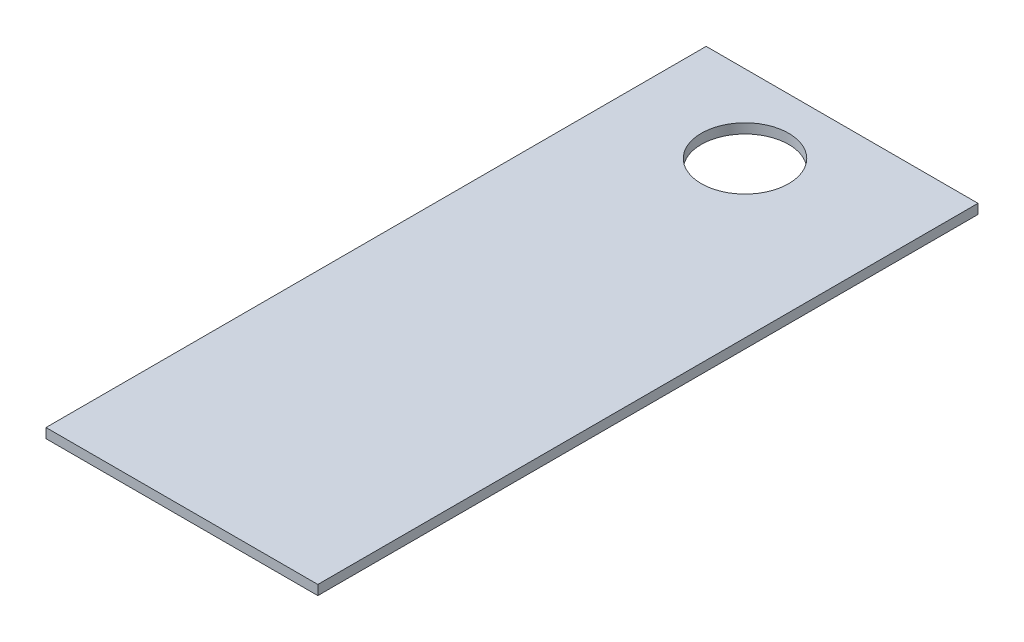
ISO-10303-21;
HEADER;
FILE_DESCRIPTION(('STEP AP214'),'2;1');
FILE_NAME('part.step','',(''),(''),'','','');
FILE_SCHEMA(('AUTOMOTIVE_DESIGN { 1 0 10303 214 1 1 1 1 }'));
ENDSEC;
DATA;
#1=APPLICATION_CONTEXT('core data for automotive mechanical design processes');
#2=APPLICATION_PROTOCOL_DEFINITION('international standard','automotive_design',2000,#1);
#3=PRODUCT_CONTEXT('',#1,'mechanical');
#4=PRODUCT('Part','Part','',(#3));
#5=PRODUCT_RELATED_PRODUCT_CATEGORY('part','',(#4));
#6=PRODUCT_DEFINITION_FORMATION('','',#4);
#7=PRODUCT_DEFINITION_CONTEXT('part definition',#1,'design');
#8=PRODUCT_DEFINITION('design','',#6,#7);
#9=PRODUCT_DEFINITION_SHAPE('','',#8);
#10=(LENGTH_UNIT() NAMED_UNIT(*) SI_UNIT(.MILLI.,.METRE.));
#11=(NAMED_UNIT(*) PLANE_ANGLE_UNIT() SI_UNIT($,.RADIAN.));
#12=(NAMED_UNIT(*) SI_UNIT($,.STERADIAN.) SOLID_ANGLE_UNIT());
#13=UNCERTAINTY_MEASURE_WITH_UNIT(LENGTH_MEASURE(1.E-05),#10,'distance_accuracy_value','');
#14=(GEOMETRIC_REPRESENTATION_CONTEXT(3) GLOBAL_UNCERTAINTY_ASSIGNED_CONTEXT((#13)) GLOBAL_UNIT_ASSIGNED_CONTEXT((#10,
#11,#12)) REPRESENTATION_CONTEXT('',''));
#15=CARTESIAN_POINT('',(0.,0.,0.));
#16=DIRECTION('',(0.,0.,1.));
#17=DIRECTION('',(1.,0.,0.));
#18=AXIS2_PLACEMENT_3D('',#15,#16,#17);
#19=CARTESIAN_POINT('',(0.,3.175,0.));
#20=DIRECTION('',(0.,-1.,0.));
#21=DIRECTION('',(0.,0.,-1.));
#22=AXIS2_PLACEMENT_3D('',#19,#20,#21);
#23=PLANE('',#22);
#24=DIRECTION('',(0.,0.,-1.));
#25=VECTOR('',#24,1.);
#26=CARTESIAN_POINT('',(44.45,3.175,107.95));
#27=LINE('',#26,#25);
#28=CARTESIAN_POINT('',(44.45,3.175,107.95));
#29=VERTEX_POINT('',#28);
#30=CARTESIAN_POINT('',(44.45,3.175,-107.95));
#31=VERTEX_POINT('',#30);
#32=EDGE_CURVE('E98',#29,#31,#27,.T.);
#33=ORIENTED_EDGE('',*,*,#32,.T.);
#34=DIRECTION('',(-1.,0.,0.));
#35=VECTOR('',#34,1.);
#36=CARTESIAN_POINT('',(-44.45,3.175,-107.95));
#37=LINE('',#36,#35);
#38=CARTESIAN_POINT('',(-44.45,3.175,-107.95));
#39=VERTEX_POINT('',#38);
#40=EDGE_CURVE('E93',#31,#39,#37,.T.);
#41=ORIENTED_EDGE('',*,*,#40,.T.);
#42=DIRECTION('',(0.,0.,1.));
#43=VECTOR('',#42,1.);
#44=CARTESIAN_POINT('',(-44.45,3.175,107.95));
#45=LINE('',#44,#43);
#46=CARTESIAN_POINT('',(-44.45,3.175,107.95));
#47=VERTEX_POINT('',#46);
#48=EDGE_CURVE('E96',#39,#47,#45,.T.);
#49=ORIENTED_EDGE('',*,*,#48,.T.);
#50=DIRECTION('',(1.,0.,0.));
#51=VECTOR('',#50,1.);
#52=CARTESIAN_POINT('',(-44.45,3.175,107.95));
#53=LINE('',#52,#51);
#54=EDGE_CURVE('E62',#47,#29,#53,.T.);
#55=ORIENTED_EDGE('',*,*,#54,.T.);
#56=EDGE_LOOP('',(#33,#41,#49,#55));
#57=FACE_BOUND('',#56,.T.);
#58=CARTESIAN_POINT('',(-6.34999999999997,3.175,-82.55));
#59=DIRECTION('',(0.,1.,0.));
#60=DIRECTION('',(0.,0.,1.));
#61=AXIS2_PLACEMENT_3D('',#58,#59,#60);
#62=CIRCLE('',#61,14.2875);
#63=CARTESIAN_POINT('',(-6.34999999999997,3.175,-68.2625));
#64=VERTEX_POINT('',#63);
#65=EDGE_CURVE('E119',#64,#64,#62,.T.);
#66=ORIENTED_EDGE('',*,*,#65,.F.);
#67=EDGE_LOOP('',(#66));
#68=FACE_BOUND('',#67,.T.);
#69=ADVANCED_FACE('F42',(#57,#68),#23,.F.);
#70=CARTESIAN_POINT('',(0.,0.,0.));
#71=DIRECTION('',(0.,-1.,0.));
#72=DIRECTION('',(0.,0.,-1.));
#73=AXIS2_PLACEMENT_3D('',#70,#71,#72);
#74=PLANE('',#73);
#75=DIRECTION('',(0.,0.,-1.));
#76=VECTOR('',#75,1.);
#77=CARTESIAN_POINT('',(44.45,0.,107.95));
#78=LINE('',#77,#76);
#79=CARTESIAN_POINT('',(44.45,0.,107.95));
#80=VERTEX_POINT('',#79);
#81=CARTESIAN_POINT('',(44.45,0.,-107.95));
#82=VERTEX_POINT('',#81);
#83=EDGE_CURVE('E115',#80,#82,#78,.T.);
#84=ORIENTED_EDGE('',*,*,#83,.F.);
#85=DIRECTION('',(1.,0.,0.));
#86=VECTOR('',#85,1.);
#87=CARTESIAN_POINT('',(-44.45,0.,107.95));
#88=LINE('',#87,#86);
#89=CARTESIAN_POINT('',(-44.45,0.,107.95));
#90=VERTEX_POINT('',#89);
#91=EDGE_CURVE('E86',#90,#80,#88,.T.);
#92=ORIENTED_EDGE('',*,*,#91,.F.);
#93=DIRECTION('',(0.,0.,1.));
#94=VECTOR('',#93,1.);
#95=CARTESIAN_POINT('',(-44.45,0.,107.95));
#96=LINE('',#95,#94);
#97=CARTESIAN_POINT('',(-44.45,0.,-107.95));
#98=VERTEX_POINT('',#97);
#99=EDGE_CURVE('E80',#98,#90,#96,.T.);
#100=ORIENTED_EDGE('',*,*,#99,.F.);
#101=DIRECTION('',(-1.,0.,0.));
#102=VECTOR('',#101,1.);
#103=CARTESIAN_POINT('',(-44.45,0.,-107.95));
#104=LINE('',#103,#102);
#105=EDGE_CURVE('E103',#82,#98,#104,.T.);
#106=ORIENTED_EDGE('',*,*,#105,.F.);
#107=EDGE_LOOP('',(#84,#92,#100,#106));
#108=FACE_BOUND('',#107,.T.);
#109=CARTESIAN_POINT('',(-6.34999999999997,0.,-82.55));
#110=DIRECTION('',(0.,1.,0.));
#111=DIRECTION('',(0.,0.,1.));
#112=AXIS2_PLACEMENT_3D('',#109,#110,#111);
#113=CIRCLE('',#112,14.2875);
#114=CARTESIAN_POINT('',(-6.34999999999997,0.,-68.2625));
#115=VERTEX_POINT('',#114);
#116=EDGE_CURVE('E135',#115,#115,#113,.T.);
#117=ORIENTED_EDGE('',*,*,#116,.T.);
#118=EDGE_LOOP('',(#117));
#119=FACE_BOUND('',#118,.T.);
#120=ADVANCED_FACE('F130',(#108,#119),#74,.T.);
#121=CARTESIAN_POINT('',(44.45,3.175,107.95));
#122=DIRECTION('',(-1.,0.,0.));
#123=DIRECTION('',(0.,0.,1.));
#124=AXIS2_PLACEMENT_3D('',#121,#122,#123);
#125=PLANE('',#124);
#126=ORIENTED_EDGE('',*,*,#83,.T.);
#127=DIRECTION('',(0.,-1.,0.));
#128=VECTOR('',#127,1.);
#129=CARTESIAN_POINT('',(44.45,3.175,-107.95));
#130=LINE('',#129,#128);
#131=EDGE_CURVE('E11',#31,#82,#130,.T.);
#132=ORIENTED_EDGE('',*,*,#131,.F.);
#133=ORIENTED_EDGE('',*,*,#32,.F.);
#134=DIRECTION('',(0.,-1.,0.));
#135=VECTOR('',#134,1.);
#136=CARTESIAN_POINT('',(44.45,3.175,107.95));
#137=LINE('',#136,#135);
#138=EDGE_CURVE('E111',#29,#80,#137,.T.);
#139=ORIENTED_EDGE('',*,*,#138,.T.);
#140=EDGE_LOOP('',(#126,#132,#133,#139));
#141=FACE_BOUND('',#140,.T.);
#142=ADVANCED_FACE('F44',(#141),#125,.F.);
#143=CARTESIAN_POINT('',(-44.45,3.175,-107.95));
#144=DIRECTION('',(0.,0.,1.));
#145=DIRECTION('',(1.,0.,0.));
#146=AXIS2_PLACEMENT_3D('',#143,#144,#145);
#147=PLANE('',#146);
#148=ORIENTED_EDGE('',*,*,#105,.T.);
#149=DIRECTION('',(0.,-1.,0.));
#150=VECTOR('',#149,1.);
#151=CARTESIAN_POINT('',(-44.45,3.175,-107.95));
#152=LINE('',#151,#150);
#153=EDGE_CURVE('E51',#39,#98,#152,.T.);
#154=ORIENTED_EDGE('',*,*,#153,.F.);
#155=ORIENTED_EDGE('',*,*,#40,.F.);
#156=ORIENTED_EDGE('',*,*,#131,.T.);
#157=EDGE_LOOP('',(#148,#154,#155,#156));
#158=FACE_BOUND('',#157,.T.);
#159=ADVANCED_FACE('F102',(#158),#147,.F.);
#160=CARTESIAN_POINT('',(-44.45,3.175,107.95));
#161=DIRECTION('',(1.,0.,0.));
#162=DIRECTION('',(0.,0.,-1.));
#163=AXIS2_PLACEMENT_3D('',#160,#161,#162);
#164=PLANE('',#163);
#165=ORIENTED_EDGE('',*,*,#99,.T.);
#166=DIRECTION('',(0.,-1.,0.));
#167=VECTOR('',#166,1.);
#168=CARTESIAN_POINT('',(-44.45,3.175,107.95));
#169=LINE('',#168,#167);
#170=EDGE_CURVE('E104',#47,#90,#169,.T.);
#171=ORIENTED_EDGE('',*,*,#170,.F.);
#172=ORIENTED_EDGE('',*,*,#48,.F.);
#173=ORIENTED_EDGE('',*,*,#153,.T.);
#174=EDGE_LOOP('',(#165,#171,#172,#173));
#175=FACE_BOUND('',#174,.T.);
#176=ADVANCED_FACE('F105',(#175),#164,.F.);
#177=CARTESIAN_POINT('',(-44.45,3.175,107.95));
#178=DIRECTION('',(0.,0.,-1.));
#179=DIRECTION('',(-1.,0.,0.));
#180=AXIS2_PLACEMENT_3D('',#177,#178,#179);
#181=PLANE('',#180);
#182=ORIENTED_EDGE('',*,*,#91,.T.);
#183=ORIENTED_EDGE('',*,*,#138,.F.);
#184=ORIENTED_EDGE('',*,*,#54,.F.);
#185=ORIENTED_EDGE('',*,*,#170,.T.);
#186=EDGE_LOOP('',(#182,#183,#184,#185));
#187=FACE_BOUND('',#186,.T.);
#188=ADVANCED_FACE('F127',(#187),#181,.F.);
#189=CARTESIAN_POINT('',(-6.34999999999997,3.175,-82.55));
#190=DIRECTION('',(0.,-1.,0.));
#191=DIRECTION('',(0.,0.,-1.));
#192=AXIS2_PLACEMENT_3D('',#189,#190,#191);
#193=CYLINDRICAL_SURFACE('',#192,14.2875);
#194=ORIENTED_EDGE('',*,*,#65,.T.);
#195=EDGE_LOOP('',(#194));
#196=FACE_BOUND('',#195,.T.);
#197=ORIENTED_EDGE('',*,*,#116,.F.);
#198=EDGE_LOOP('',(#197));
#199=FACE_BOUND('',#198,.T.);
#200=ADVANCED_FACE('F143',(#196,#199),#193,.F.);
#201=CLOSED_SHELL('',(#69,#120,#142,#159,#176,#188,#200));
#202=MANIFOLD_SOLID_BREP('B2',#201);
#203=ADVANCED_BREP_SHAPE_REPRESENTATION('',(#18,#202),#14);
#204=SHAPE_DEFINITION_REPRESENTATION(#9,#203);
ENDSEC;
END-ISO-10303-21;
